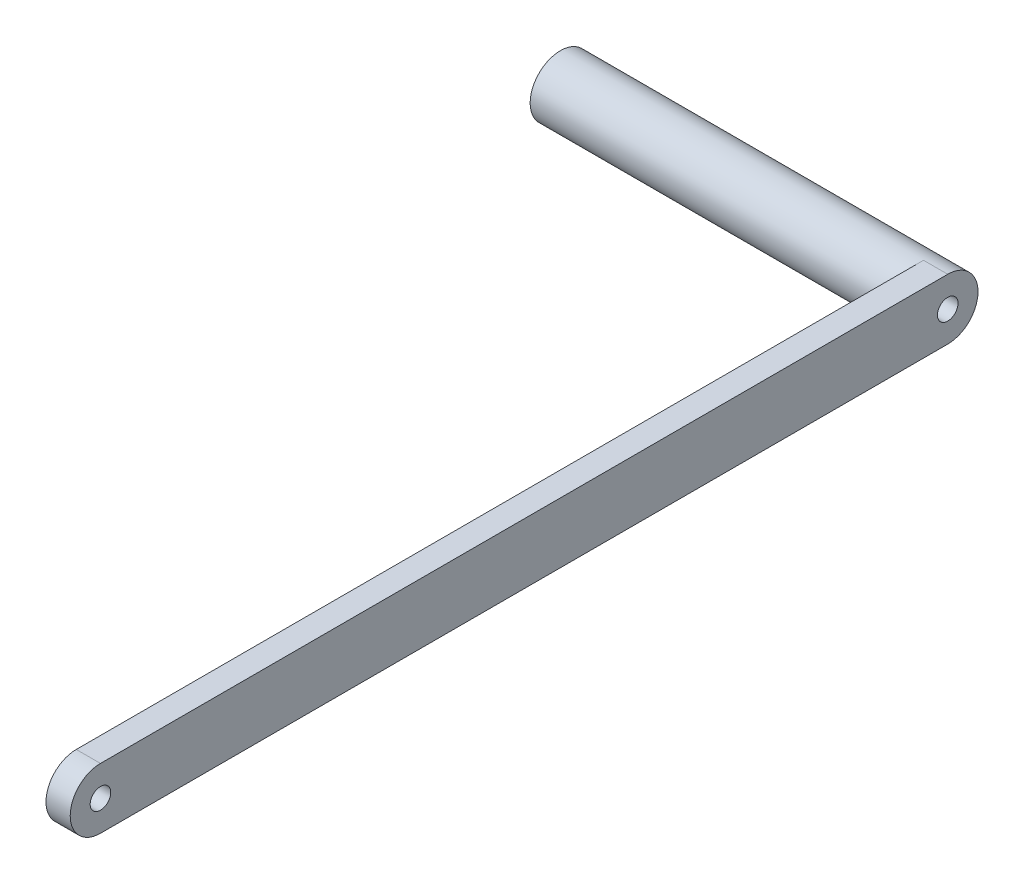
ISO-10303-21;
HEADER;
FILE_DESCRIPTION(('STEP AP214'),'2;1');
FILE_NAME('part.step','',(''),(''),'','','');
FILE_SCHEMA(('AUTOMOTIVE_DESIGN { 1 0 10303 214 1 1 1 1 }'));
ENDSEC;
DATA;
#1=APPLICATION_CONTEXT('core data for automotive mechanical design processes');
#2=APPLICATION_PROTOCOL_DEFINITION('international standard','automotive_design',2000,#1);
#3=PRODUCT_CONTEXT('',#1,'mechanical');
#4=PRODUCT('Part','Part','',(#3));
#5=PRODUCT_RELATED_PRODUCT_CATEGORY('part','',(#4));
#6=PRODUCT_DEFINITION_FORMATION('','',#4);
#7=PRODUCT_DEFINITION_CONTEXT('part definition',#1,'design');
#8=PRODUCT_DEFINITION('design','',#6,#7);
#9=PRODUCT_DEFINITION_SHAPE('','',#8);
#10=(LENGTH_UNIT() NAMED_UNIT(*) SI_UNIT(.MILLI.,.METRE.));
#11=(NAMED_UNIT(*) PLANE_ANGLE_UNIT() SI_UNIT($,.RADIAN.));
#12=(NAMED_UNIT(*) SI_UNIT($,.STERADIAN.) SOLID_ANGLE_UNIT());
#13=UNCERTAINTY_MEASURE_WITH_UNIT(LENGTH_MEASURE(1.E-05),#10,'distance_accuracy_value','');
#14=(GEOMETRIC_REPRESENTATION_CONTEXT(3) GLOBAL_UNCERTAINTY_ASSIGNED_CONTEXT((#13)) GLOBAL_UNIT_ASSIGNED_CONTEXT((#10,
#11,#12)) REPRESENTATION_CONTEXT('',''));
#15=CARTESIAN_POINT('',(0.,0.,0.));
#16=DIRECTION('',(0.,0.,1.));
#17=DIRECTION('',(1.,0.,0.));
#18=AXIS2_PLACEMENT_3D('',#15,#16,#17);
#19=CARTESIAN_POINT('',(2.,0.,35.));
#20=DIRECTION('',(-1.,0.,0.));
#21=DIRECTION('',(0.,0.,1.));
#22=AXIS2_PLACEMENT_3D('',#19,#20,#21);
#23=CYLINDRICAL_SURFACE('',#22,2.5);
#24=CARTESIAN_POINT('',(0.,0.,35.));
#25=DIRECTION('',(1.,0.,0.));
#26=DIRECTION('',(0.,0.,-1.));
#27=AXIS2_PLACEMENT_3D('',#24,#25,#26);
#28=CIRCLE('',#27,2.5);
#29=CARTESIAN_POINT('',(0.,2.5,35.));
#30=VERTEX_POINT('',#29);
#31=CARTESIAN_POINT('',(0.,-2.5,35.));
#32=VERTEX_POINT('',#31);
#33=EDGE_CURVE('E80',#30,#32,#28,.T.);
#34=ORIENTED_EDGE('',*,*,#33,.T.);
#35=DIRECTION('',(-1.,0.,0.));
#36=VECTOR('',#35,1.);
#37=CARTESIAN_POINT('',(2.,-2.5,35.));
#38=LINE('',#37,#36);
#39=CARTESIAN_POINT('',(2.,-2.5,35.));
#40=VERTEX_POINT('',#39);
#41=EDGE_CURVE('E35',#40,#32,#38,.T.);
#42=ORIENTED_EDGE('',*,*,#41,.F.);
#43=CARTESIAN_POINT('',(2.,0.,35.));
#44=DIRECTION('',(1.,0.,0.));
#45=DIRECTION('',(0.,0.,-1.));
#46=AXIS2_PLACEMENT_3D('',#43,#44,#45);
#47=CIRCLE('',#46,2.5);
#48=CARTESIAN_POINT('',(2.,2.5,35.));
#49=VERTEX_POINT('',#48);
#50=EDGE_CURVE('E81',#49,#40,#47,.T.);
#51=ORIENTED_EDGE('',*,*,#50,.F.);
#52=DIRECTION('',(-1.,0.,0.));
#53=VECTOR('',#52,1.);
#54=CARTESIAN_POINT('',(2.,2.5,35.));
#55=LINE('',#54,#53);
#56=EDGE_CURVE('E90',#49,#30,#55,.T.);
#57=ORIENTED_EDGE('',*,*,#56,.T.);
#58=EDGE_LOOP('',(#34,#42,#51,#57));
#59=FACE_BOUND('',#58,.T.);
#60=ADVANCED_FACE('F32',(#59),#23,.T.);
#61=CARTESIAN_POINT('',(2.,-2.5,35.));
#62=DIRECTION('',(0.,1.,0.));
#63=DIRECTION('',(0.,0.,1.));
#64=AXIS2_PLACEMENT_3D('',#61,#62,#63);
#65=PLANE('',#64);
#66=DIRECTION('',(0.,0.,-1.));
#67=VECTOR('',#66,1.);
#68=CARTESIAN_POINT('',(0.,-2.5,35.));
#69=LINE('',#68,#67);
#70=CARTESIAN_POINT('',(0.,-2.49999999999999,-35.));
#71=VERTEX_POINT('',#70);
#72=EDGE_CURVE('E82',#32,#71,#69,.T.);
#73=ORIENTED_EDGE('',*,*,#72,.T.);
#74=DIRECTION('',(-1.,0.,0.));
#75=VECTOR('',#74,1.);
#76=CARTESIAN_POINT('',(2.,-2.49999999999999,-35.));
#77=LINE('',#76,#75);
#78=CARTESIAN_POINT('',(2.,-2.49999999999999,-35.));
#79=VERTEX_POINT('',#78);
#80=EDGE_CURVE('E89',#79,#71,#77,.T.);
#81=ORIENTED_EDGE('',*,*,#80,.F.);
#82=DIRECTION('',(0.,0.,-1.));
#83=VECTOR('',#82,1.);
#84=CARTESIAN_POINT('',(2.,-2.5,35.));
#85=LINE('',#84,#83);
#86=EDGE_CURVE('E75',#40,#79,#85,.T.);
#87=ORIENTED_EDGE('',*,*,#86,.F.);
#88=ORIENTED_EDGE('',*,*,#41,.T.);
#89=EDGE_LOOP('',(#73,#81,#87,#88));
#90=FACE_BOUND('',#89,.T.);
#91=ADVANCED_FACE('F137',(#90),#65,.F.);
#92=CARTESIAN_POINT('',(2.,0.,-35.));
#93=DIRECTION('',(-1.,0.,0.));
#94=DIRECTION('',(0.,0.,1.));
#95=AXIS2_PLACEMENT_3D('',#92,#93,#94);
#96=CYLINDRICAL_SURFACE('',#95,2.5);
#97=ORIENTED_EDGE('',*,*,#80,.T.);
#98=CARTESIAN_POINT('',(0.,0.,-35.));
#99=DIRECTION('',(-1.,0.,0.));
#100=DIRECTION('',(0.,0.,1.));
#101=AXIS2_PLACEMENT_3D('',#98,#99,#100);
#102=CIRCLE('',#101,2.5);
#103=CARTESIAN_POINT('',(0.,2.50000000000001,-35.));
#104=VERTEX_POINT('',#103);
#105=EDGE_CURVE('E11',#71,#104,#102,.T.);
#106=ORIENTED_EDGE('',*,*,#105,.T.);
#107=DIRECTION('',(-1.,0.,0.));
#108=VECTOR('',#107,1.);
#109=CARTESIAN_POINT('',(2.,2.50000000000001,-35.));
#110=LINE('',#109,#108);
#111=CARTESIAN_POINT('',(2.,2.50000000000001,-35.));
#112=VERTEX_POINT('',#111);
#113=EDGE_CURVE('E85',#112,#104,#110,.T.);
#114=ORIENTED_EDGE('',*,*,#113,.F.);
#115=CARTESIAN_POINT('',(2.,0.,-35.));
#116=DIRECTION('',(1.,0.,0.));
#117=DIRECTION('',(0.,0.,-1.));
#118=AXIS2_PLACEMENT_3D('',#115,#116,#117);
#119=CIRCLE('',#118,2.5);
#120=EDGE_CURVE('E95',#79,#112,#119,.T.);
#121=ORIENTED_EDGE('',*,*,#120,.F.);
#122=EDGE_LOOP('',(#97,#106,#114,#121));
#123=FACE_BOUND('',#122,.T.);
#124=CARTESIAN_POINT('',(-30.,0.,-35.));
#125=DIRECTION('',(-1.,0.,0.));
#126=DIRECTION('',(0.,0.,1.));
#127=AXIS2_PLACEMENT_3D('',#124,#125,#126);
#128=CIRCLE('',#127,2.5);
#129=CARTESIAN_POINT('',(-30.,0.,-32.5));
#130=VERTEX_POINT('',#129);
#131=EDGE_CURVE('E100',#130,#130,#128,.T.);
#132=ORIENTED_EDGE('',*,*,#131,.F.);
#133=EDGE_LOOP('',(#132));
#134=FACE_BOUND('',#133,.T.);
#135=ADVANCED_FACE('F93',(#123,#134),#96,.T.);
#136=CARTESIAN_POINT('',(2.,2.5,35.));
#137=DIRECTION('',(0.,-1.,0.));
#138=DIRECTION('',(0.,0.,-1.));
#139=AXIS2_PLACEMENT_3D('',#136,#137,#138);
#140=PLANE('',#139);
#141=DIRECTION('',(0.,0.,1.));
#142=VECTOR('',#141,1.);
#143=CARTESIAN_POINT('',(0.,2.5,35.));
#144=LINE('',#143,#142);
#145=EDGE_CURVE('E67',#104,#30,#144,.T.);
#146=ORIENTED_EDGE('',*,*,#145,.T.);
#147=ORIENTED_EDGE('',*,*,#56,.F.);
#148=DIRECTION('',(0.,0.,1.));
#149=VECTOR('',#148,1.);
#150=CARTESIAN_POINT('',(2.,2.5,35.));
#151=LINE('',#150,#149);
#152=EDGE_CURVE('E49',#112,#49,#151,.T.);
#153=ORIENTED_EDGE('',*,*,#152,.F.);
#154=ORIENTED_EDGE('',*,*,#113,.T.);
#155=EDGE_LOOP('',(#146,#147,#153,#154));
#156=FACE_BOUND('',#155,.T.);
#157=ADVANCED_FACE('F86',(#156),#140,.F.);
#158=CARTESIAN_POINT('',(2.,0.,35.));
#159=DIRECTION('',(1.,0.,0.));
#160=DIRECTION('',(0.,0.,-1.));
#161=AXIS2_PLACEMENT_3D('',#158,#159,#160);
#162=PLANE('',#161);
#163=CARTESIAN_POINT('',(2.,0.,35.));
#164=DIRECTION('',(1.,0.,0.));
#165=DIRECTION('',(0.,0.,-1.));
#166=AXIS2_PLACEMENT_3D('',#163,#164,#165);
#167=CIRCLE('',#166,0.850000000000007);
#168=CARTESIAN_POINT('',(2.,0.,34.15));
#169=VERTEX_POINT('',#168);
#170=EDGE_CURVE('E114',#169,#169,#167,.F.);
#171=ORIENTED_EDGE('',*,*,#170,.T.);
#172=EDGE_LOOP('',(#171));
#173=FACE_BOUND('',#172,.T.);
#174=CARTESIAN_POINT('',(2.,0.,-35.));
#175=DIRECTION('',(1.,0.,0.));
#176=DIRECTION('',(0.,0.,-1.));
#177=AXIS2_PLACEMENT_3D('',#174,#175,#176);
#178=CIRCLE('',#177,0.850000000000007);
#179=CARTESIAN_POINT('',(2.,0.,-35.85));
#180=VERTEX_POINT('',#179);
#181=EDGE_CURVE('E108',#180,#180,#178,.F.);
#182=ORIENTED_EDGE('',*,*,#181,.T.);
#183=EDGE_LOOP('',(#182));
#184=FACE_BOUND('',#183,.T.);
#185=ORIENTED_EDGE('',*,*,#50,.T.);
#186=ORIENTED_EDGE('',*,*,#86,.T.);
#187=ORIENTED_EDGE('',*,*,#120,.T.);
#188=ORIENTED_EDGE('',*,*,#152,.T.);
#189=EDGE_LOOP('',(#185,#186,#187,#188));
#190=FACE_BOUND('',#189,.T.);
#191=ADVANCED_FACE('F124',(#173,#184,#190),#162,.T.);
#192=CARTESIAN_POINT('',(0.,0.,35.));
#193=DIRECTION('',(1.,0.,0.));
#194=DIRECTION('',(0.,0.,-1.));
#195=AXIS2_PLACEMENT_3D('',#192,#193,#194);
#196=PLANE('',#195);
#197=CARTESIAN_POINT('',(0.,0.,35.));
#198=DIRECTION('',(-1.,0.,0.));
#199=DIRECTION('',(0.,0.,1.));
#200=AXIS2_PLACEMENT_3D('',#197,#198,#199);
#201=CIRCLE('',#200,0.850000000000007);
#202=CARTESIAN_POINT('',(0.,0.,35.85));
#203=VERTEX_POINT('',#202);
#204=EDGE_CURVE('E111',#203,#203,#201,.T.);
#205=ORIENTED_EDGE('',*,*,#204,.F.);
#206=EDGE_LOOP('',(#205));
#207=FACE_BOUND('',#206,.T.);
#208=ORIENTED_EDGE('',*,*,#105,.F.);
#209=ORIENTED_EDGE('',*,*,#72,.F.);
#210=ORIENTED_EDGE('',*,*,#33,.F.);
#211=ORIENTED_EDGE('',*,*,#145,.F.);
#212=EDGE_LOOP('',(#208,#209,#210,#211));
#213=FACE_BOUND('',#212,.T.);
#214=ADVANCED_FACE('F78',(#207,#213),#196,.F.);
#215=CARTESIAN_POINT('',(-30.,0.,-35.));
#216=DIRECTION('',(-1.,0.,0.));
#217=DIRECTION('',(0.,0.,1.));
#218=AXIS2_PLACEMENT_3D('',#215,#216,#217);
#219=PLANE('',#218);
#220=CARTESIAN_POINT('',(-30.,0.,-35.));
#221=DIRECTION('',(-1.,0.,0.));
#222=DIRECTION('',(0.,0.,1.));
#223=AXIS2_PLACEMENT_3D('',#220,#221,#222);
#224=CIRCLE('',#223,0.850000000000007);
#225=CARTESIAN_POINT('',(-30.,0.,-34.15));
#226=VERTEX_POINT('',#225);
#227=EDGE_CURVE('E107',#226,#226,#224,.T.);
#228=ORIENTED_EDGE('',*,*,#227,.F.);
#229=EDGE_LOOP('',(#228));
#230=FACE_BOUND('',#229,.T.);
#231=ORIENTED_EDGE('',*,*,#131,.T.);
#232=EDGE_LOOP('',(#231));
#233=FACE_BOUND('',#232,.T.);
#234=ADVANCED_FACE('F123',(#230,#233),#219,.T.);
#235=CARTESIAN_POINT('',(2.001,0.,-35.));
#236=DIRECTION('',(-1.,0.,0.));
#237=DIRECTION('',(0.,0.,1.));
#238=AXIS2_PLACEMENT_3D('',#235,#236,#237);
#239=CYLINDRICAL_SURFACE('',#238,0.850000000000007);
#240=ORIENTED_EDGE('',*,*,#181,.F.);
#241=EDGE_LOOP('',(#240));
#242=FACE_BOUND('',#241,.T.);
#243=ORIENTED_EDGE('',*,*,#227,.T.);
#244=EDGE_LOOP('',(#243));
#245=FACE_BOUND('',#244,.T.);
#246=ADVANCED_FACE('F130',(#242,#245),#239,.F.);
#247=CARTESIAN_POINT('',(2.001,0.,35.));
#248=DIRECTION('',(-1.,0.,0.));
#249=DIRECTION('',(0.,0.,1.));
#250=AXIS2_PLACEMENT_3D('',#247,#248,#249);
#251=CYLINDRICAL_SURFACE('',#250,0.850000000000007);
#252=ORIENTED_EDGE('',*,*,#170,.F.);
#253=EDGE_LOOP('',(#252));
#254=FACE_BOUND('',#253,.T.);
#255=ORIENTED_EDGE('',*,*,#204,.T.);
#256=EDGE_LOOP('',(#255));
#257=FACE_BOUND('',#256,.T.);
#258=ADVANCED_FACE('F120',(#254,#257),#251,.F.);
#259=CLOSED_SHELL('',(#60,#91,#135,#157,#191,#214,#234,#246,#258));
#260=MANIFOLD_SOLID_BREP('B2',#259);
#261=ADVANCED_BREP_SHAPE_REPRESENTATION('',(#18,#260),#14);
#262=SHAPE_DEFINITION_REPRESENTATION(#9,#261);
ENDSEC;
END-ISO-10303-21;
